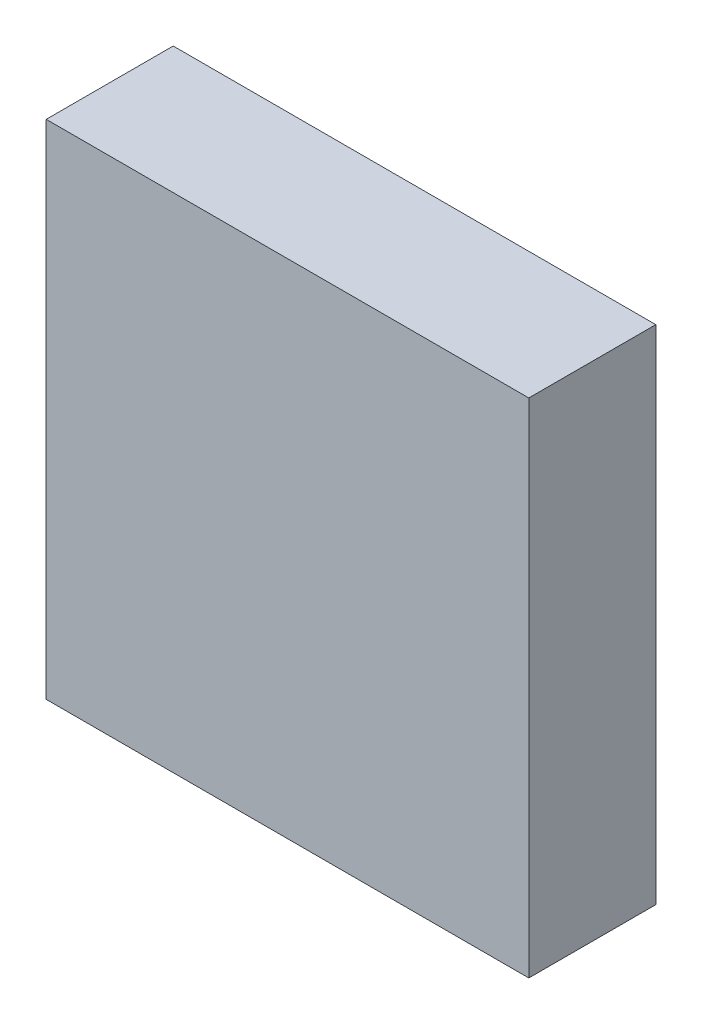
ISO-10303-21;
HEADER;
FILE_DESCRIPTION(('STEP AP214'),'2;1');
FILE_NAME('part.step','',(''),(''),'','','');
FILE_SCHEMA(('AUTOMOTIVE_DESIGN { 1 0 10303 214 1 1 1 1 }'));
ENDSEC;
DATA;
#1=APPLICATION_CONTEXT('core data for automotive mechanical design processes');
#2=APPLICATION_PROTOCOL_DEFINITION('international standard','automotive_design',2000,#1);
#3=PRODUCT_CONTEXT('',#1,'mechanical');
#4=PRODUCT('Part','Part','',(#3));
#5=PRODUCT_RELATED_PRODUCT_CATEGORY('part','',(#4));
#6=PRODUCT_DEFINITION_FORMATION('','',#4);
#7=PRODUCT_DEFINITION_CONTEXT('part definition',#1,'design');
#8=PRODUCT_DEFINITION('design','',#6,#7);
#9=PRODUCT_DEFINITION_SHAPE('','',#8);
#10=(LENGTH_UNIT() NAMED_UNIT(*) SI_UNIT(.MILLI.,.METRE.));
#11=(NAMED_UNIT(*) PLANE_ANGLE_UNIT() SI_UNIT($,.RADIAN.));
#12=(NAMED_UNIT(*) SI_UNIT($,.STERADIAN.) SOLID_ANGLE_UNIT());
#13=UNCERTAINTY_MEASURE_WITH_UNIT(LENGTH_MEASURE(1.E-05),#10,'distance_accuracy_value','');
#14=(GEOMETRIC_REPRESENTATION_CONTEXT(3) GLOBAL_UNCERTAINTY_ASSIGNED_CONTEXT((#13)) GLOBAL_UNIT_ASSIGNED_CONTEXT((#10,
#11,#12)) REPRESENTATION_CONTEXT('',''));
#15=CARTESIAN_POINT('',(0.,0.,0.));
#16=DIRECTION('',(0.,0.,1.));
#17=DIRECTION('',(1.,0.,0.));
#18=AXIS2_PLACEMENT_3D('',#15,#16,#17);
#19=CARTESIAN_POINT('',(0.,1780.,0.));
#20=DIRECTION('',(1.,0.,0.));
#21=DIRECTION('',(0.,0.,-1.));
#22=AXIS2_PLACEMENT_3D('',#19,#20,#21);
#23=PLANE('',#22);
#24=DIRECTION('',(0.,0.,1.));
#25=VECTOR('',#24,1.);
#26=CARTESIAN_POINT('',(0.,0.,0.));
#27=LINE('',#26,#25);
#28=CARTESIAN_POINT('',(0.,0.,-450.));
#29=VERTEX_POINT('',#28);
#30=CARTESIAN_POINT('',(0.,0.,0.));
#31=VERTEX_POINT('',#30);
#32=EDGE_CURVE('E96',#29,#31,#27,.T.);
#33=ORIENTED_EDGE('',*,*,#32,.T.);
#34=DIRECTION('',(0.,-1.,0.));
#35=VECTOR('',#34,1.);
#36=CARTESIAN_POINT('',(0.,1780.,0.));
#37=LINE('',#36,#35);
#38=CARTESIAN_POINT('',(0.,1780.,0.));
#39=VERTEX_POINT('',#38);
#40=EDGE_CURVE('E11',#39,#31,#37,.T.);
#41=ORIENTED_EDGE('',*,*,#40,.F.);
#42=DIRECTION('',(0.,0.,1.));
#43=VECTOR('',#42,1.);
#44=CARTESIAN_POINT('',(0.,1780.,0.));
#45=LINE('',#44,#43);
#46=CARTESIAN_POINT('',(0.,1780.,-450.));
#47=VERTEX_POINT('',#46);
#48=EDGE_CURVE('E84',#47,#39,#45,.T.);
#49=ORIENTED_EDGE('',*,*,#48,.F.);
#50=DIRECTION('',(0.,-1.,0.));
#51=VECTOR('',#50,1.);
#52=CARTESIAN_POINT('',(0.,1780.,-450.));
#53=LINE('',#52,#51);
#54=EDGE_CURVE('E92',#47,#29,#53,.T.);
#55=ORIENTED_EDGE('',*,*,#54,.T.);
#56=EDGE_LOOP('',(#33,#41,#49,#55));
#57=FACE_BOUND('',#56,.T.);
#58=ADVANCED_FACE('F33',(#57),#23,.F.);
#59=CARTESIAN_POINT('',(0.,1780.,0.));
#60=DIRECTION('',(0.,0.,-1.));
#61=DIRECTION('',(-1.,0.,0.));
#62=AXIS2_PLACEMENT_3D('',#59,#60,#61);
#63=PLANE('',#62);
#64=DIRECTION('',(1.,0.,0.));
#65=VECTOR('',#64,1.);
#66=CARTESIAN_POINT('',(0.,0.,0.));
#67=LINE('',#66,#65);
#68=CARTESIAN_POINT('',(1710.,0.,0.));
#69=VERTEX_POINT('',#68);
#70=EDGE_CURVE('E88',#31,#69,#67,.T.);
#71=ORIENTED_EDGE('',*,*,#70,.T.);
#72=DIRECTION('',(0.,-1.,0.));
#73=VECTOR('',#72,1.);
#74=CARTESIAN_POINT('',(1710.,1780.,0.));
#75=LINE('',#74,#73);
#76=CARTESIAN_POINT('',(1710.,1780.,0.));
#77=VERTEX_POINT('',#76);
#78=EDGE_CURVE('E41',#77,#69,#75,.T.);
#79=ORIENTED_EDGE('',*,*,#78,.F.);
#80=DIRECTION('',(1.,0.,0.));
#81=VECTOR('',#80,1.);
#82=CARTESIAN_POINT('',(0.,1780.,0.));
#83=LINE('',#82,#81);
#84=EDGE_CURVE('E79',#39,#77,#83,.T.);
#85=ORIENTED_EDGE('',*,*,#84,.F.);
#86=ORIENTED_EDGE('',*,*,#40,.T.);
#87=EDGE_LOOP('',(#71,#79,#85,#86));
#88=FACE_BOUND('',#87,.T.);
#89=ADVANCED_FACE('F87',(#88),#63,.F.);
#90=CARTESIAN_POINT('',(1710.,1780.,0.));
#91=DIRECTION('',(-1.,0.,0.));
#92=DIRECTION('',(0.,0.,1.));
#93=AXIS2_PLACEMENT_3D('',#90,#91,#92);
#94=PLANE('',#93);
#95=DIRECTION('',(0.,0.,-1.));
#96=VECTOR('',#95,1.);
#97=CARTESIAN_POINT('',(1710.,0.,0.));
#98=LINE('',#97,#96);
#99=CARTESIAN_POINT('',(1710.,0.,-450.));
#100=VERTEX_POINT('',#99);
#101=EDGE_CURVE('E66',#69,#100,#98,.T.);
#102=ORIENTED_EDGE('',*,*,#101,.T.);
#103=DIRECTION('',(0.,-1.,0.));
#104=VECTOR('',#103,1.);
#105=CARTESIAN_POINT('',(1710.,1780.,-450.));
#106=LINE('',#105,#104);
#107=CARTESIAN_POINT('',(1710.,1780.,-450.));
#108=VERTEX_POINT('',#107);
#109=EDGE_CURVE('E89',#108,#100,#106,.T.);
#110=ORIENTED_EDGE('',*,*,#109,.F.);
#111=DIRECTION('',(0.,0.,-1.));
#112=VECTOR('',#111,1.);
#113=CARTESIAN_POINT('',(1710.,1780.,0.));
#114=LINE('',#113,#112);
#115=EDGE_CURVE('E82',#77,#108,#114,.T.);
#116=ORIENTED_EDGE('',*,*,#115,.F.);
#117=ORIENTED_EDGE('',*,*,#78,.T.);
#118=EDGE_LOOP('',(#102,#110,#116,#117));
#119=FACE_BOUND('',#118,.T.);
#120=ADVANCED_FACE('F90',(#119),#94,.F.);
#121=CARTESIAN_POINT('',(0.,1780.,-450.));
#122=DIRECTION('',(0.,0.,1.));
#123=DIRECTION('',(1.,0.,0.));
#124=AXIS2_PLACEMENT_3D('',#121,#122,#123);
#125=PLANE('',#124);
#126=DIRECTION('',(-1.,0.,0.));
#127=VECTOR('',#126,1.);
#128=CARTESIAN_POINT('',(0.,0.,-450.));
#129=LINE('',#128,#127);
#130=EDGE_CURVE('E72',#100,#29,#129,.T.);
#131=ORIENTED_EDGE('',*,*,#130,.T.);
#132=ORIENTED_EDGE('',*,*,#54,.F.);
#133=DIRECTION('',(-1.,0.,0.));
#134=VECTOR('',#133,1.);
#135=CARTESIAN_POINT('',(0.,1780.,-450.));
#136=LINE('',#135,#134);
#137=EDGE_CURVE('E49',#108,#47,#136,.T.);
#138=ORIENTED_EDGE('',*,*,#137,.F.);
#139=ORIENTED_EDGE('',*,*,#109,.T.);
#140=EDGE_LOOP('',(#131,#132,#138,#139));
#141=FACE_BOUND('',#140,.T.);
#142=ADVANCED_FACE('F103',(#141),#125,.F.);
#143=CARTESIAN_POINT('',(0.,1780.,0.));
#144=DIRECTION('',(0.,-1.,0.));
#145=DIRECTION('',(0.,0.,-1.));
#146=AXIS2_PLACEMENT_3D('',#143,#144,#145);
#147=PLANE('',#146);
#148=ORIENTED_EDGE('',*,*,#48,.T.);
#149=ORIENTED_EDGE('',*,*,#84,.T.);
#150=ORIENTED_EDGE('',*,*,#115,.T.);
#151=ORIENTED_EDGE('',*,*,#137,.T.);
#152=EDGE_LOOP('',(#148,#149,#150,#151));
#153=FACE_BOUND('',#152,.T.);
#154=ADVANCED_FACE('F80',(#153),#147,.F.);
#155=CARTESIAN_POINT('',(0.,0.,0.));
#156=DIRECTION('',(0.,-1.,0.));
#157=DIRECTION('',(0.,0.,-1.));
#158=AXIS2_PLACEMENT_3D('',#155,#156,#157);
#159=PLANE('',#158);
#160=ORIENTED_EDGE('',*,*,#32,.F.);
#161=ORIENTED_EDGE('',*,*,#130,.F.);
#162=ORIENTED_EDGE('',*,*,#101,.F.);
#163=ORIENTED_EDGE('',*,*,#70,.F.);
#164=EDGE_LOOP('',(#160,#161,#162,#163));
#165=FACE_BOUND('',#164,.T.);
#166=ADVANCED_FACE('F106',(#165),#159,.T.);
#167=CLOSED_SHELL('',(#58,#89,#120,#142,#154,#166));
#168=MANIFOLD_SOLID_BREP('B2',#167);
#169=ADVANCED_BREP_SHAPE_REPRESENTATION('',(#18,#168),#14);
#170=SHAPE_DEFINITION_REPRESENTATION(#9,#169);
ENDSEC;
END-ISO-10303-21;
